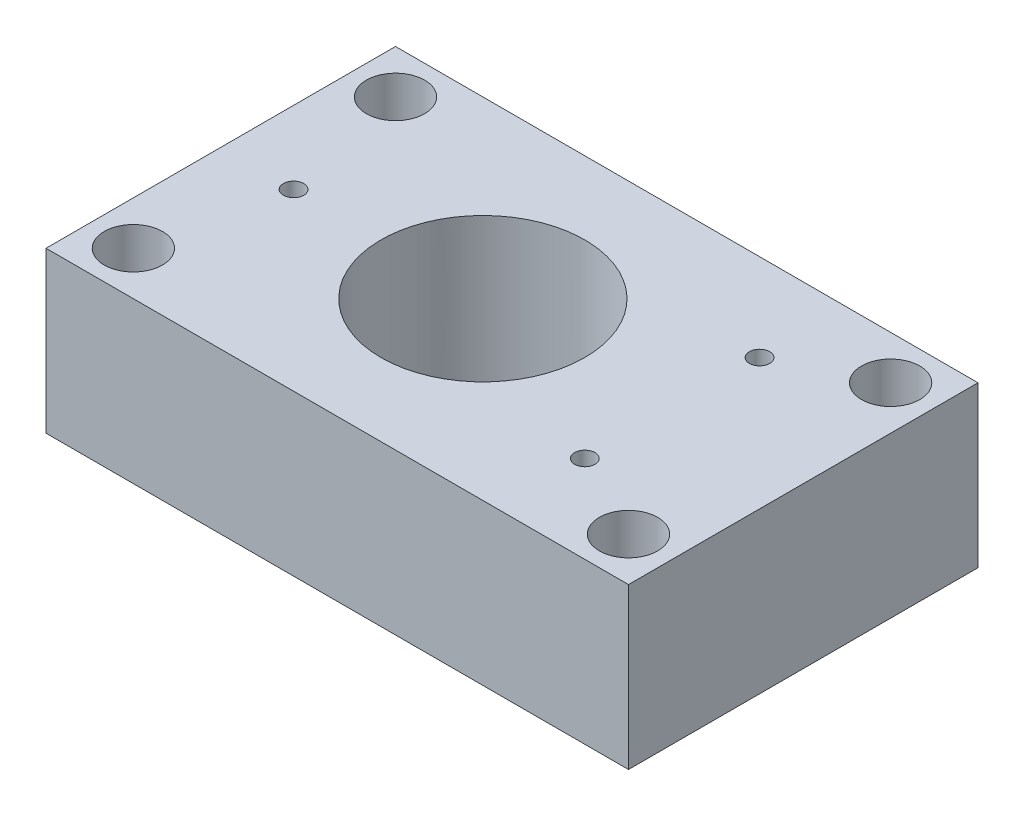
ISO-10303-21;
HEADER;
FILE_DESCRIPTION(('STEP AP214'),'2;1');
FILE_NAME('part.step','',(''),(''),'','','');
FILE_SCHEMA(('AUTOMOTIVE_DESIGN { 1 0 10303 214 1 1 1 1 }'));
ENDSEC;
DATA;
#1=APPLICATION_CONTEXT('core data for automotive mechanical design processes');
#2=APPLICATION_PROTOCOL_DEFINITION('international standard','automotive_design',2000,#1);
#3=PRODUCT_CONTEXT('',#1,'mechanical');
#4=PRODUCT('Part','Part','',(#3));
#5=PRODUCT_RELATED_PRODUCT_CATEGORY('part','',(#4));
#6=PRODUCT_DEFINITION_FORMATION('','',#4);
#7=PRODUCT_DEFINITION_CONTEXT('part definition',#1,'design');
#8=PRODUCT_DEFINITION('design','',#6,#7);
#9=PRODUCT_DEFINITION_SHAPE('','',#8);
#10=(LENGTH_UNIT() NAMED_UNIT(*) SI_UNIT(.MILLI.,.METRE.));
#11=(NAMED_UNIT(*) PLANE_ANGLE_UNIT() SI_UNIT($,.RADIAN.));
#12=(NAMED_UNIT(*) SI_UNIT($,.STERADIAN.) SOLID_ANGLE_UNIT());
#13=UNCERTAINTY_MEASURE_WITH_UNIT(LENGTH_MEASURE(1.E-05),#10,'distance_accuracy_value','');
#14=(GEOMETRIC_REPRESENTATION_CONTEXT(3) GLOBAL_UNCERTAINTY_ASSIGNED_CONTEXT((#13)) GLOBAL_UNIT_ASSIGNED_CONTEXT((#10,
#11,#12)) REPRESENTATION_CONTEXT('',''));
#15=CARTESIAN_POINT('',(0.,0.,0.));
#16=DIRECTION('',(0.,0.,1.));
#17=DIRECTION('',(1.,0.,0.));
#18=AXIS2_PLACEMENT_3D('',#15,#16,#17);
#19=CARTESIAN_POINT('',(1.5,5.5,1.5));
#20=DIRECTION('',(0.,-1.,0.));
#21=DIRECTION('',(0.,0.,-1.));
#22=AXIS2_PLACEMENT_3D('',#19,#20,#21);
#23=CYLINDRICAL_SURFACE('',#22,0.75);
#24=CARTESIAN_POINT('',(1.5,0.,1.5));
#25=DIRECTION('',(0.,1.,0.));
#26=DIRECTION('',(0.,0.,1.));
#27=AXIS2_PLACEMENT_3D('',#24,#25,#26);
#28=CIRCLE('',#27,0.75);
#29=CARTESIAN_POINT('',(1.5,0.,2.25));
#30=VERTEX_POINT('',#29);
#31=EDGE_CURVE('E164',#30,#30,#28,.F.);
#32=ORIENTED_EDGE('',*,*,#31,.T.);
#33=EDGE_LOOP('',(#32));
#34=FACE_BOUND('',#33,.T.);
#35=CARTESIAN_POINT('',(1.5,1.,1.5));
#36=DIRECTION('',(0.,1.,0.));
#37=DIRECTION('',(0.,0.,1.));
#38=AXIS2_PLACEMENT_3D('',#35,#36,#37);
#39=CIRCLE('',#38,0.75);
#40=CARTESIAN_POINT('',(1.5,1.,2.25));
#41=VERTEX_POINT('',#40);
#42=EDGE_CURVE('E56',#41,#41,#39,.T.);
#43=ORIENTED_EDGE('',*,*,#42,.T.);
#44=EDGE_LOOP('',(#43));
#45=FACE_BOUND('',#44,.T.);
#46=ADVANCED_FACE('F52',(#34,#45),#23,.F.);
#47=CARTESIAN_POINT('',(18.5,5.5,1.5));
#48=DIRECTION('',(0.,-1.,0.));
#49=DIRECTION('',(0.,0.,-1.));
#50=AXIS2_PLACEMENT_3D('',#47,#48,#49);
#51=CYLINDRICAL_SURFACE('',#50,0.750000000000002);
#52=CARTESIAN_POINT('',(18.5,0.,1.5));
#53=DIRECTION('',(0.,1.,0.));
#54=DIRECTION('',(0.,0.,1.));
#55=AXIS2_PLACEMENT_3D('',#52,#53,#54);
#56=CIRCLE('',#55,0.750000000000002);
#57=CARTESIAN_POINT('',(18.5,0.,2.25));
#58=VERTEX_POINT('',#57);
#59=EDGE_CURVE('E177',#58,#58,#56,.F.);
#60=ORIENTED_EDGE('',*,*,#59,.T.);
#61=EDGE_LOOP('',(#60));
#62=FACE_BOUND('',#61,.T.);
#63=CARTESIAN_POINT('',(18.5,1.,1.5));
#64=DIRECTION('',(0.,1.,0.));
#65=DIRECTION('',(0.,0.,1.));
#66=AXIS2_PLACEMENT_3D('',#63,#64,#65);
#67=CIRCLE('',#66,0.750000000000002);
#68=CARTESIAN_POINT('',(18.5,1.,2.25));
#69=VERTEX_POINT('',#68);
#70=EDGE_CURVE('E191',#69,#69,#67,.T.);
#71=ORIENTED_EDGE('',*,*,#70,.T.);
#72=EDGE_LOOP('',(#71));
#73=FACE_BOUND('',#72,.T.);
#74=ADVANCED_FACE('F238',(#62,#73),#51,.F.);
#75=CARTESIAN_POINT('',(18.5,5.5,10.5));
#76=DIRECTION('',(0.,-1.,0.));
#77=DIRECTION('',(0.,0.,-1.));
#78=AXIS2_PLACEMENT_3D('',#75,#76,#77);
#79=CYLINDRICAL_SURFACE('',#78,0.750000000000002);
#80=CARTESIAN_POINT('',(18.5,0.,10.5));
#81=DIRECTION('',(0.,1.,0.));
#82=DIRECTION('',(0.,0.,1.));
#83=AXIS2_PLACEMENT_3D('',#80,#81,#82);
#84=CIRCLE('',#83,0.750000000000002);
#85=CARTESIAN_POINT('',(18.5,0.,11.25));
#86=VERTEX_POINT('',#85);
#87=EDGE_CURVE('E180',#86,#86,#84,.F.);
#88=ORIENTED_EDGE('',*,*,#87,.T.);
#89=EDGE_LOOP('',(#88));
#90=FACE_BOUND('',#89,.T.);
#91=CARTESIAN_POINT('',(18.5,1.,10.5));
#92=DIRECTION('',(0.,1.,0.));
#93=DIRECTION('',(0.,0.,1.));
#94=AXIS2_PLACEMENT_3D('',#91,#92,#93);
#95=CIRCLE('',#94,0.750000000000002);
#96=CARTESIAN_POINT('',(18.5,1.,11.25));
#97=VERTEX_POINT('',#96);
#98=EDGE_CURVE('E188',#97,#97,#95,.T.);
#99=ORIENTED_EDGE('',*,*,#98,.T.);
#100=EDGE_LOOP('',(#99));
#101=FACE_BOUND('',#100,.T.);
#102=ADVANCED_FACE('F233',(#90,#101),#79,.F.);
#103=CARTESIAN_POINT('',(1.5,5.5,10.5));
#104=DIRECTION('',(0.,-1.,0.));
#105=DIRECTION('',(0.,0.,-1.));
#106=AXIS2_PLACEMENT_3D('',#103,#104,#105);
#107=CYLINDRICAL_SURFACE('',#106,0.75);
#108=CARTESIAN_POINT('',(1.5,0.,10.5));
#109=DIRECTION('',(0.,1.,0.));
#110=DIRECTION('',(0.,0.,1.));
#111=AXIS2_PLACEMENT_3D('',#108,#109,#110);
#112=CIRCLE('',#111,0.75);
#113=CARTESIAN_POINT('',(1.5,0.,11.25));
#114=VERTEX_POINT('',#113);
#115=EDGE_CURVE('E128',#114,#114,#112,.F.);
#116=ORIENTED_EDGE('',*,*,#115,.T.);
#117=EDGE_LOOP('',(#116));
#118=FACE_BOUND('',#117,.T.);
#119=CARTESIAN_POINT('',(1.5,1.,10.5));
#120=DIRECTION('',(0.,1.,0.));
#121=DIRECTION('',(0.,0.,1.));
#122=AXIS2_PLACEMENT_3D('',#119,#120,#121);
#123=CIRCLE('',#122,0.75);
#124=CARTESIAN_POINT('',(1.5,1.,11.25));
#125=VERTEX_POINT('',#124);
#126=EDGE_CURVE('E185',#125,#125,#123,.T.);
#127=ORIENTED_EDGE('',*,*,#126,.T.);
#128=EDGE_LOOP('',(#127));
#129=FACE_BOUND('',#128,.T.);
#130=ADVANCED_FACE('F228',(#118,#129),#107,.F.);
#131=CARTESIAN_POINT('',(9.,5.5,6.));
#132=DIRECTION('',(0.,-1.,0.));
#133=DIRECTION('',(0.,0.,-1.));
#134=AXIS2_PLACEMENT_3D('',#131,#132,#133);
#135=CYLINDRICAL_SURFACE('',#134,3.5);
#136=CARTESIAN_POINT('',(9.,5.5,6.));
#137=DIRECTION('',(0.,1.,0.));
#138=DIRECTION('',(0.,0.,1.));
#139=AXIS2_PLACEMENT_3D('',#136,#137,#138);
#140=CIRCLE('',#139,3.5);
#141=CARTESIAN_POINT('',(9.,5.5,9.5));
#142=VERTEX_POINT('',#141);
#143=EDGE_CURVE('E131',#142,#142,#140,.T.);
#144=ORIENTED_EDGE('',*,*,#143,.T.);
#145=EDGE_LOOP('',(#144));
#146=FACE_BOUND('',#145,.T.);
#147=CARTESIAN_POINT('',(9.,1.6,6.));
#148=DIRECTION('',(0.,1.,0.));
#149=DIRECTION('',(0.,0.,1.));
#150=AXIS2_PLACEMENT_3D('',#147,#148,#149);
#151=CIRCLE('',#150,3.5);
#152=CARTESIAN_POINT('',(12.435625,1.6,6.66819223235159));
#153=VERTEX_POINT('',#152);
#154=CARTESIAN_POINT('',(12.435625,1.6,5.3318077676484));
#155=VERTEX_POINT('',#154);
#156=EDGE_CURVE('E121',#153,#155,#151,.T.);
#157=ORIENTED_EDGE('',*,*,#156,.F.);
#158=DIRECTION('',(0.,-1.,0.));
#159=VECTOR('',#158,1.);
#160=CARTESIAN_POINT('',(12.435625,0.8,6.66819223235159));
#161=LINE('',#160,#159);
#162=CARTESIAN_POINT('',(12.435625,0.,6.66819223235159));
#163=VERTEX_POINT('',#162);
#164=EDGE_CURVE('E13',#153,#163,#161,.T.);
#165=ORIENTED_EDGE('',*,*,#164,.T.);
#166=CARTESIAN_POINT('',(9.,0.,6.));
#167=DIRECTION('',(0.,1.,0.));
#168=DIRECTION('',(0.,0.,1.));
#169=AXIS2_PLACEMENT_3D('',#166,#167,#168);
#170=CIRCLE('',#169,3.5);
#171=CARTESIAN_POINT('',(12.435625,0.,5.3318077676484));
#172=VERTEX_POINT('',#171);
#173=EDGE_CURVE('E127',#172,#163,#170,.T.);
#174=ORIENTED_EDGE('',*,*,#173,.F.);
#175=DIRECTION('',(0.,-1.,0.));
#176=VECTOR('',#175,1.);
#177=CARTESIAN_POINT('',(12.435625,0.8,5.3318077676484));
#178=LINE('',#177,#176);
#179=EDGE_CURVE('E61',#172,#155,#178,.F.);
#180=ORIENTED_EDGE('',*,*,#179,.T.);
#181=EDGE_LOOP('',(#157,#165,#174,#180));
#182=FACE_BOUND('',#181,.T.);
#183=ADVANCED_FACE('F130',(#146,#182),#135,.F.);
#184=CARTESIAN_POINT('',(0.,5.5,0.));
#185=DIRECTION('',(0.,1.,0.));
#186=DIRECTION('',(0.,0.,1.));
#187=AXIS2_PLACEMENT_3D('',#184,#185,#186);
#188=PLANE('',#187);
#189=CARTESIAN_POINT('',(18.5,5.5,10.5));
#190=DIRECTION('',(0.,1.,0.));
#191=DIRECTION('',(0.,0.,1.));
#192=AXIS2_PLACEMENT_3D('',#189,#190,#191);
#193=CIRCLE('',#192,1.);
#194=CARTESIAN_POINT('',(18.5,5.5,11.5));
#195=VERTEX_POINT('',#194);
#196=EDGE_CURVE('E316',#195,#195,#193,.T.);
#197=ORIENTED_EDGE('',*,*,#196,.F.);
#198=EDGE_LOOP('',(#197));
#199=FACE_BOUND('',#198,.T.);
#200=CARTESIAN_POINT('',(18.5,5.5,1.5));
#201=DIRECTION('',(0.,1.,0.));
#202=DIRECTION('',(0.,0.,1.));
#203=AXIS2_PLACEMENT_3D('',#200,#201,#202);
#204=CIRCLE('',#203,1.);
#205=CARTESIAN_POINT('',(18.5,5.5,2.5));
#206=VERTEX_POINT('',#205);
#207=EDGE_CURVE('E322',#206,#206,#204,.T.);
#208=ORIENTED_EDGE('',*,*,#207,.F.);
#209=EDGE_LOOP('',(#208));
#210=FACE_BOUND('',#209,.T.);
#211=CARTESIAN_POINT('',(1.5,5.5,1.5));
#212=DIRECTION('',(0.,1.,0.));
#213=DIRECTION('',(0.,0.,1.));
#214=AXIS2_PLACEMENT_3D('',#211,#212,#213);
#215=CIRCLE('',#214,1.);
#216=CARTESIAN_POINT('',(1.5,5.5,2.5));
#217=VERTEX_POINT('',#216);
#218=EDGE_CURVE('E327',#217,#217,#215,.T.);
#219=ORIENTED_EDGE('',*,*,#218,.F.);
#220=EDGE_LOOP('',(#219));
#221=FACE_BOUND('',#220,.T.);
#222=CARTESIAN_POINT('',(1.5,5.5,10.5));
#223=DIRECTION('',(0.,1.,0.));
#224=DIRECTION('',(0.,0.,1.));
#225=AXIS2_PLACEMENT_3D('',#222,#223,#224);
#226=CIRCLE('',#225,1.);
#227=CARTESIAN_POINT('',(1.5,5.5,11.5));
#228=VERTEX_POINT('',#227);
#229=EDGE_CURVE('E325',#228,#228,#226,.T.);
#230=ORIENTED_EDGE('',*,*,#229,.F.);
#231=EDGE_LOOP('',(#230));
#232=FACE_BOUND('',#231,.T.);
#233=CARTESIAN_POINT('',(15.5,5.5,3.));
#234=DIRECTION('',(0.,1.,0.));
#235=DIRECTION('',(0.,0.,1.));
#236=AXIS2_PLACEMENT_3D('',#233,#234,#235);
#237=CIRCLE('',#236,0.350000000000001);
#238=CARTESIAN_POINT('',(15.5,5.5,3.35));
#239=VERTEX_POINT('',#238);
#240=EDGE_CURVE('E168',#239,#239,#237,.T.);
#241=ORIENTED_EDGE('',*,*,#240,.F.);
#242=EDGE_LOOP('',(#241));
#243=FACE_BOUND('',#242,.T.);
#244=CARTESIAN_POINT('',(15.5,5.5,9.));
#245=DIRECTION('',(0.,1.,0.));
#246=DIRECTION('',(0.,0.,1.));
#247=AXIS2_PLACEMENT_3D('',#244,#245,#246);
#248=CIRCLE('',#247,0.350000000000001);
#249=CARTESIAN_POINT('',(15.5,5.5,9.35));
#250=VERTEX_POINT('',#249);
#251=EDGE_CURVE('E200',#250,#250,#248,.T.);
#252=ORIENTED_EDGE('',*,*,#251,.F.);
#253=EDGE_LOOP('',(#252));
#254=FACE_BOUND('',#253,.T.);
#255=CARTESIAN_POINT('',(2.5,5.5,6.));
#256=DIRECTION('',(0.,1.,0.));
#257=DIRECTION('',(0.,0.,1.));
#258=AXIS2_PLACEMENT_3D('',#255,#256,#257);
#259=CIRCLE('',#258,0.350000000000001);
#260=CARTESIAN_POINT('',(2.5,5.5,6.35));
#261=VERTEX_POINT('',#260);
#262=EDGE_CURVE('E196',#261,#261,#259,.T.);
#263=ORIENTED_EDGE('',*,*,#262,.F.);
#264=EDGE_LOOP('',(#263));
#265=FACE_BOUND('',#264,.T.);
#266=DIRECTION('',(0.,0.,1.));
#267=VECTOR('',#266,1.);
#268=CARTESIAN_POINT('',(0.,5.5,0.));
#269=LINE('',#268,#267);
#270=CARTESIAN_POINT('',(0.,5.5,0.));
#271=VERTEX_POINT('',#270);
#272=CARTESIAN_POINT('',(0.,5.5,12.));
#273=VERTEX_POINT('',#272);
#274=EDGE_CURVE('E138',#271,#273,#269,.T.);
#275=ORIENTED_EDGE('',*,*,#274,.T.);
#276=DIRECTION('',(1.,0.,0.));
#277=VECTOR('',#276,1.);
#278=CARTESIAN_POINT('',(0.,5.5,12.));
#279=LINE('',#278,#277);
#280=CARTESIAN_POINT('',(20.,5.5,12.));
#281=VERTEX_POINT('',#280);
#282=EDGE_CURVE('E104',#273,#281,#279,.T.);
#283=ORIENTED_EDGE('',*,*,#282,.T.);
#284=DIRECTION('',(0.,0.,1.));
#285=VECTOR('',#284,1.);
#286=CARTESIAN_POINT('',(20.,5.5,0.));
#287=LINE('',#286,#285);
#288=CARTESIAN_POINT('',(20.,5.5,0.));
#289=VERTEX_POINT('',#288);
#290=EDGE_CURVE('E142',#289,#281,#287,.T.);
#291=ORIENTED_EDGE('',*,*,#290,.F.);
#292=DIRECTION('',(1.,0.,0.));
#293=VECTOR('',#292,1.);
#294=CARTESIAN_POINT('',(0.,5.5,0.));
#295=LINE('',#294,#293);
#296=EDGE_CURVE('E145',#271,#289,#295,.T.);
#297=ORIENTED_EDGE('',*,*,#296,.F.);
#298=EDGE_LOOP('',(#275,#283,#291,#297));
#299=FACE_BOUND('',#298,.T.);
#300=ORIENTED_EDGE('',*,*,#143,.F.);
#301=EDGE_LOOP('',(#300));
#302=FACE_BOUND('',#301,.T.);
#303=ADVANCED_FACE('F214',(#199,#210,#221,#232,#243,#254,#265,#299,#302),#188,.T.);
#304=CARTESIAN_POINT('',(0.,0.,0.));
#305=DIRECTION('',(0.,1.,0.));
#306=DIRECTION('',(0.,0.,1.));
#307=AXIS2_PLACEMENT_3D('',#304,#305,#306);
#308=PLANE('',#307);
#309=ORIENTED_EDGE('',*,*,#115,.F.);
#310=EDGE_LOOP('',(#309));
#311=FACE_BOUND('',#310,.T.);
#312=ORIENTED_EDGE('',*,*,#87,.F.);
#313=EDGE_LOOP('',(#312));
#314=FACE_BOUND('',#313,.T.);
#315=ORIENTED_EDGE('',*,*,#59,.F.);
#316=EDGE_LOOP('',(#315));
#317=FACE_BOUND('',#316,.T.);
#318=CARTESIAN_POINT('',(15.5,0.,3.));
#319=DIRECTION('',(0.,1.,0.));
#320=DIRECTION('',(0.,0.,1.));
#321=AXIS2_PLACEMENT_3D('',#318,#319,#320);
#322=CIRCLE('',#321,0.350000000000001);
#323=CARTESIAN_POINT('',(15.5,0.,3.35));
#324=VERTEX_POINT('',#323);
#325=EDGE_CURVE('E174',#324,#324,#322,.F.);
#326=ORIENTED_EDGE('',*,*,#325,.F.);
#327=EDGE_LOOP('',(#326));
#328=FACE_BOUND('',#327,.T.);
#329=CARTESIAN_POINT('',(15.5,0.,9.));
#330=DIRECTION('',(0.,1.,0.));
#331=DIRECTION('',(0.,0.,1.));
#332=AXIS2_PLACEMENT_3D('',#329,#330,#331);
#333=CIRCLE('',#332,0.350000000000001);
#334=CARTESIAN_POINT('',(15.5,0.,9.35));
#335=VERTEX_POINT('',#334);
#336=EDGE_CURVE('E171',#335,#335,#333,.F.);
#337=ORIENTED_EDGE('',*,*,#336,.F.);
#338=EDGE_LOOP('',(#337));
#339=FACE_BOUND('',#338,.T.);
#340=CARTESIAN_POINT('',(2.5,0.,6.));
#341=DIRECTION('',(0.,1.,0.));
#342=DIRECTION('',(0.,0.,1.));
#343=AXIS2_PLACEMENT_3D('',#340,#341,#342);
#344=CIRCLE('',#343,0.350000000000001);
#345=CARTESIAN_POINT('',(2.5,0.,6.35));
#346=VERTEX_POINT('',#345);
#347=EDGE_CURVE('E167',#346,#346,#344,.F.);
#348=ORIENTED_EDGE('',*,*,#347,.F.);
#349=EDGE_LOOP('',(#348));
#350=FACE_BOUND('',#349,.T.);
#351=ORIENTED_EDGE('',*,*,#31,.F.);
#352=EDGE_LOOP('',(#351));
#353=FACE_BOUND('',#352,.T.);
#354=CARTESIAN_POINT('',(15.,0.,5.99999999999999));
#355=DIRECTION('',(0.,1.,0.));
#356=DIRECTION('',(0.,0.,1.));
#357=AXIS2_PLACEMENT_3D('',#354,#355,#356);
#358=CIRCLE('',#357,2.65);
#359=EDGE_CURVE('E117',#163,#172,#358,.T.);
#360=ORIENTED_EDGE('',*,*,#359,.T.);
#361=ORIENTED_EDGE('',*,*,#173,.T.);
#362=EDGE_LOOP('',(#360,#361));
#363=FACE_BOUND('',#362,.T.);
#364=DIRECTION('',(0.,0.,1.));
#365=VECTOR('',#364,1.);
#366=CARTESIAN_POINT('',(0.,0.,0.));
#367=LINE('',#366,#365);
#368=CARTESIAN_POINT('',(0.,0.,0.));
#369=VERTEX_POINT('',#368);
#370=CARTESIAN_POINT('',(0.,0.,12.));
#371=VERTEX_POINT('',#370);
#372=EDGE_CURVE('E134',#369,#371,#367,.T.);
#373=ORIENTED_EDGE('',*,*,#372,.F.);
#374=DIRECTION('',(1.,0.,0.));
#375=VECTOR('',#374,1.);
#376=CARTESIAN_POINT('',(0.,0.,0.));
#377=LINE('',#376,#375);
#378=CARTESIAN_POINT('',(20.,0.,0.));
#379=VERTEX_POINT('',#378);
#380=EDGE_CURVE('E140',#369,#379,#377,.T.);
#381=ORIENTED_EDGE('',*,*,#380,.T.);
#382=DIRECTION('',(0.,0.,1.));
#383=VECTOR('',#382,1.);
#384=CARTESIAN_POINT('',(20.,0.,0.));
#385=LINE('',#384,#383);
#386=CARTESIAN_POINT('',(20.,0.,12.));
#387=VERTEX_POINT('',#386);
#388=EDGE_CURVE('E151',#379,#387,#385,.T.);
#389=ORIENTED_EDGE('',*,*,#388,.T.);
#390=DIRECTION('',(1.,0.,0.));
#391=VECTOR('',#390,1.);
#392=CARTESIAN_POINT('',(0.,0.,12.));
#393=LINE('',#392,#391);
#394=EDGE_CURVE('E148',#371,#387,#393,.T.);
#395=ORIENTED_EDGE('',*,*,#394,.F.);
#396=EDGE_LOOP('',(#373,#381,#389,#395));
#397=FACE_BOUND('',#396,.T.);
#398=ADVANCED_FACE('F125',(#311,#314,#317,#328,#339,#350,#353,#363,#397),#308,.F.);
#399=CARTESIAN_POINT('',(0.,5.5,0.));
#400=DIRECTION('',(1.,0.,0.));
#401=DIRECTION('',(0.,0.,-1.));
#402=AXIS2_PLACEMENT_3D('',#399,#400,#401);
#403=PLANE('',#402);
#404=ORIENTED_EDGE('',*,*,#372,.T.);
#405=DIRECTION('',(0.,-1.,0.));
#406=VECTOR('',#405,1.);
#407=CARTESIAN_POINT('',(0.,5.5,12.));
#408=LINE('',#407,#406);
#409=EDGE_CURVE('E161',#273,#371,#408,.T.);
#410=ORIENTED_EDGE('',*,*,#409,.F.);
#411=ORIENTED_EDGE('',*,*,#274,.F.);
#412=DIRECTION('',(0.,-1.,0.));
#413=VECTOR('',#412,1.);
#414=CARTESIAN_POINT('',(0.,5.5,0.));
#415=LINE('',#414,#413);
#416=EDGE_CURVE('E77',#271,#369,#415,.T.);
#417=ORIENTED_EDGE('',*,*,#416,.T.);
#418=EDGE_LOOP('',(#404,#410,#411,#417));
#419=FACE_BOUND('',#418,.T.);
#420=ADVANCED_FACE('F54',(#419),#403,.F.);
#421=CARTESIAN_POINT('',(0.,5.5,12.));
#422=DIRECTION('',(0.,0.,-1.));
#423=DIRECTION('',(-1.,0.,0.));
#424=AXIS2_PLACEMENT_3D('',#421,#422,#423);
#425=PLANE('',#424);
#426=ORIENTED_EDGE('',*,*,#394,.T.);
#427=DIRECTION('',(0.,-1.,0.));
#428=VECTOR('',#427,1.);
#429=CARTESIAN_POINT('',(20.,5.5,12.));
#430=LINE('',#429,#428);
#431=EDGE_CURVE('E159',#281,#387,#430,.T.);
#432=ORIENTED_EDGE('',*,*,#431,.F.);
#433=ORIENTED_EDGE('',*,*,#282,.F.);
#434=ORIENTED_EDGE('',*,*,#409,.T.);
#435=EDGE_LOOP('',(#426,#432,#433,#434));
#436=FACE_BOUND('',#435,.T.);
#437=ADVANCED_FACE('F261',(#436),#425,.F.);
#438=CARTESIAN_POINT('',(20.,5.5,0.));
#439=DIRECTION('',(1.,0.,0.));
#440=DIRECTION('',(0.,0.,-1.));
#441=AXIS2_PLACEMENT_3D('',#438,#439,#440);
#442=PLANE('',#441);
#443=ORIENTED_EDGE('',*,*,#388,.F.);
#444=DIRECTION('',(0.,-1.,0.));
#445=VECTOR('',#444,1.);
#446=CARTESIAN_POINT('',(20.,5.5,0.));
#447=LINE('',#446,#445);
#448=EDGE_CURVE('E157',#289,#379,#447,.T.);
#449=ORIENTED_EDGE('',*,*,#448,.F.);
#450=ORIENTED_EDGE('',*,*,#290,.T.);
#451=ORIENTED_EDGE('',*,*,#431,.T.);
#452=EDGE_LOOP('',(#443,#449,#450,#451));
#453=FACE_BOUND('',#452,.T.);
#454=ADVANCED_FACE('F256',(#453),#442,.T.);
#455=CARTESIAN_POINT('',(0.,5.5,0.));
#456=DIRECTION('',(0.,0.,-1.));
#457=DIRECTION('',(-1.,0.,0.));
#458=AXIS2_PLACEMENT_3D('',#455,#456,#457);
#459=PLANE('',#458);
#460=ORIENTED_EDGE('',*,*,#380,.F.);
#461=ORIENTED_EDGE('',*,*,#416,.F.);
#462=ORIENTED_EDGE('',*,*,#296,.T.);
#463=ORIENTED_EDGE('',*,*,#448,.T.);
#464=EDGE_LOOP('',(#460,#461,#462,#463));
#465=FACE_BOUND('',#464,.T.);
#466=ADVANCED_FACE('F252',(#465),#459,.T.);
#467=CARTESIAN_POINT('',(15.,1.6,5.99999999999999));
#468=DIRECTION('',(0.,-1.,0.));
#469=DIRECTION('',(0.,0.,-1.));
#470=AXIS2_PLACEMENT_3D('',#467,#468,#469);
#471=CYLINDRICAL_SURFACE('',#470,2.65);
#472=CARTESIAN_POINT('',(15.,1.6,5.99999999999999));
#473=DIRECTION('',(0.,1.,0.));
#474=DIRECTION('',(0.,0.,1.));
#475=AXIS2_PLACEMENT_3D('',#472,#473,#474);
#476=CIRCLE('',#475,2.65);
#477=EDGE_CURVE('E68',#153,#155,#476,.T.);
#478=ORIENTED_EDGE('',*,*,#477,.T.);
#479=ORIENTED_EDGE('',*,*,#179,.F.);
#480=ORIENTED_EDGE('',*,*,#359,.F.);
#481=ORIENTED_EDGE('',*,*,#164,.F.);
#482=EDGE_LOOP('',(#478,#479,#480,#481));
#483=FACE_BOUND('',#482,.T.);
#484=ADVANCED_FACE('F116',(#483),#471,.F.);
#485=CARTESIAN_POINT('',(15.,1.6,5.99999999999999));
#486=DIRECTION('',(0.,1.,0.));
#487=DIRECTION('',(0.,0.,1.));
#488=AXIS2_PLACEMENT_3D('',#485,#486,#487);
#489=PLANE('',#488);
#490=ORIENTED_EDGE('',*,*,#156,.T.);
#491=ORIENTED_EDGE('',*,*,#477,.F.);
#492=EDGE_LOOP('',(#490,#491));
#493=FACE_BOUND('',#492,.T.);
#494=ADVANCED_FACE('F248',(#493),#489,.F.);
#495=CARTESIAN_POINT('',(2.5,5.5,6.));
#496=DIRECTION('',(0.,-1.,0.));
#497=DIRECTION('',(0.,0.,-1.));
#498=AXIS2_PLACEMENT_3D('',#495,#496,#497);
#499=CYLINDRICAL_SURFACE('',#498,0.350000000000001);
#500=ORIENTED_EDGE('',*,*,#262,.T.);
#501=EDGE_LOOP('',(#500));
#502=FACE_BOUND('',#501,.T.);
#503=ORIENTED_EDGE('',*,*,#347,.T.);
#504=EDGE_LOOP('',(#503));
#505=FACE_BOUND('',#504,.T.);
#506=ADVANCED_FACE('F250',(#502,#505),#499,.F.);
#507=CARTESIAN_POINT('',(15.5,5.5,9.));
#508=DIRECTION('',(0.,-1.,0.));
#509=DIRECTION('',(0.,0.,-1.));
#510=AXIS2_PLACEMENT_3D('',#507,#508,#509);
#511=CYLINDRICAL_SURFACE('',#510,0.350000000000001);
#512=ORIENTED_EDGE('',*,*,#251,.T.);
#513=EDGE_LOOP('',(#512));
#514=FACE_BOUND('',#513,.T.);
#515=ORIENTED_EDGE('',*,*,#336,.T.);
#516=EDGE_LOOP('',(#515));
#517=FACE_BOUND('',#516,.T.);
#518=ADVANCED_FACE('F290',(#514,#517),#511,.F.);
#519=CARTESIAN_POINT('',(15.5,5.5,3.));
#520=DIRECTION('',(0.,-1.,0.));
#521=DIRECTION('',(0.,0.,-1.));
#522=AXIS2_PLACEMENT_3D('',#519,#520,#521);
#523=CYLINDRICAL_SURFACE('',#522,0.350000000000001);
#524=ORIENTED_EDGE('',*,*,#240,.T.);
#525=EDGE_LOOP('',(#524));
#526=FACE_BOUND('',#525,.T.);
#527=ORIENTED_EDGE('',*,*,#325,.T.);
#528=EDGE_LOOP('',(#527));
#529=FACE_BOUND('',#528,.T.);
#530=ADVANCED_FACE('F211',(#526,#529),#523,.F.);
#531=CARTESIAN_POINT('',(1.5,-2.82842712474619,10.5));
#532=DIRECTION('',(0.,1.,0.));
#533=DIRECTION('',(0.,0.,1.));
#534=AXIS2_PLACEMENT_3D('',#531,#532,#533);
#535=CYLINDRICAL_SURFACE('',#534,1.);
#536=CARTESIAN_POINT('',(1.5,1.,10.5));
#537=DIRECTION('',(0.,1.,0.));
#538=DIRECTION('',(0.,0.,1.));
#539=AXIS2_PLACEMENT_3D('',#536,#537,#538);
#540=CIRCLE('',#539,1.);
#541=CARTESIAN_POINT('',(1.5,1.,11.5));
#542=VERTEX_POINT('',#541);
#543=EDGE_CURVE('E189',#542,#542,#540,.F.);
#544=ORIENTED_EDGE('',*,*,#543,.T.);
#545=EDGE_LOOP('',(#544));
#546=FACE_BOUND('',#545,.T.);
#547=ORIENTED_EDGE('',*,*,#229,.T.);
#548=EDGE_LOOP('',(#547));
#549=FACE_BOUND('',#548,.T.);
#550=ADVANCED_FACE('F331',(#546,#549),#535,.F.);
#551=CARTESIAN_POINT('',(0.,1.,0.));
#552=DIRECTION('',(0.,1.,0.));
#553=DIRECTION('',(0.,0.,1.));
#554=AXIS2_PLACEMENT_3D('',#551,#552,#553);
#555=PLANE('',#554);
#556=ORIENTED_EDGE('',*,*,#126,.F.);
#557=EDGE_LOOP('',(#556));
#558=FACE_BOUND('',#557,.T.);
#559=ORIENTED_EDGE('',*,*,#543,.F.);
#560=EDGE_LOOP('',(#559));
#561=FACE_BOUND('',#560,.T.);
#562=ADVANCED_FACE('F334',(#558,#561),#555,.T.);
#563=CARTESIAN_POINT('',(18.5,-2.82842712474619,10.5));
#564=DIRECTION('',(0.,1.,0.));
#565=DIRECTION('',(0.,0.,1.));
#566=AXIS2_PLACEMENT_3D('',#563,#564,#565);
#567=CYLINDRICAL_SURFACE('',#566,1.);
#568=CARTESIAN_POINT('',(18.5,1.,10.5));
#569=DIRECTION('',(0.,1.,0.));
#570=DIRECTION('',(0.,0.,1.));
#571=AXIS2_PLACEMENT_3D('',#568,#569,#570);
#572=CIRCLE('',#571,1.);
#573=CARTESIAN_POINT('',(18.5,1.,11.5));
#574=VERTEX_POINT('',#573);
#575=EDGE_CURVE('E314',#574,#574,#572,.F.);
#576=ORIENTED_EDGE('',*,*,#575,.T.);
#577=EDGE_LOOP('',(#576));
#578=FACE_BOUND('',#577,.T.);
#579=ORIENTED_EDGE('',*,*,#196,.T.);
#580=EDGE_LOOP('',(#579));
#581=FACE_BOUND('',#580,.T.);
#582=ADVANCED_FACE('F310',(#578,#581),#567,.F.);
#583=CARTESIAN_POINT('',(0.,1.,0.));
#584=DIRECTION('',(0.,1.,0.));
#585=DIRECTION('',(0.,0.,1.));
#586=AXIS2_PLACEMENT_3D('',#583,#584,#585);
#587=PLANE('',#586);
#588=ORIENTED_EDGE('',*,*,#98,.F.);
#589=EDGE_LOOP('',(#588));
#590=FACE_BOUND('',#589,.T.);
#591=ORIENTED_EDGE('',*,*,#575,.F.);
#592=EDGE_LOOP('',(#591));
#593=FACE_BOUND('',#592,.T.);
#594=ADVANCED_FACE('F306',(#590,#593),#587,.T.);
#595=CARTESIAN_POINT('',(18.5,-2.82842712474619,1.5));
#596=DIRECTION('',(0.,1.,0.));
#597=DIRECTION('',(0.,0.,1.));
#598=AXIS2_PLACEMENT_3D('',#595,#596,#597);
#599=CYLINDRICAL_SURFACE('',#598,1.);
#600=CARTESIAN_POINT('',(18.5,1.,1.5));
#601=DIRECTION('',(0.,1.,0.));
#602=DIRECTION('',(0.,0.,1.));
#603=AXIS2_PLACEMENT_3D('',#600,#601,#602);
#604=CIRCLE('',#603,1.);
#605=CARTESIAN_POINT('',(18.5,1.,2.5));
#606=VERTEX_POINT('',#605);
#607=EDGE_CURVE('E319',#606,#606,#604,.F.);
#608=ORIENTED_EDGE('',*,*,#607,.T.);
#609=EDGE_LOOP('',(#608));
#610=FACE_BOUND('',#609,.T.);
#611=ORIENTED_EDGE('',*,*,#207,.T.);
#612=EDGE_LOOP('',(#611));
#613=FACE_BOUND('',#612,.T.);
#614=ADVANCED_FACE('F309',(#610,#613),#599,.F.);
#615=CARTESIAN_POINT('',(0.,1.,0.));
#616=DIRECTION('',(0.,1.,0.));
#617=DIRECTION('',(0.,0.,1.));
#618=AXIS2_PLACEMENT_3D('',#615,#616,#617);
#619=PLANE('',#618);
#620=ORIENTED_EDGE('',*,*,#70,.F.);
#621=EDGE_LOOP('',(#620));
#622=FACE_BOUND('',#621,.T.);
#623=ORIENTED_EDGE('',*,*,#607,.F.);
#624=EDGE_LOOP('',(#623));
#625=FACE_BOUND('',#624,.T.);
#626=ADVANCED_FACE('F345',(#622,#625),#619,.T.);
#627=CARTESIAN_POINT('',(1.5,-2.82842712474619,1.5));
#628=DIRECTION('',(0.,1.,0.));
#629=DIRECTION('',(0.,0.,1.));
#630=AXIS2_PLACEMENT_3D('',#627,#628,#629);
#631=CYLINDRICAL_SURFACE('',#630,1.);
#632=CARTESIAN_POINT('',(1.5,1.,1.5));
#633=DIRECTION('',(0.,1.,0.));
#634=DIRECTION('',(0.,0.,1.));
#635=AXIS2_PLACEMENT_3D('',#632,#633,#634);
#636=CIRCLE('',#635,1.);
#637=CARTESIAN_POINT('',(1.5,1.,2.5));
#638=VERTEX_POINT('',#637);
#639=EDGE_CURVE('E364',#638,#638,#636,.F.);
#640=ORIENTED_EDGE('',*,*,#639,.T.);
#641=EDGE_LOOP('',(#640));
#642=FACE_BOUND('',#641,.T.);
#643=ORIENTED_EDGE('',*,*,#218,.T.);
#644=EDGE_LOOP('',(#643));
#645=FACE_BOUND('',#644,.T.);
#646=ADVANCED_FACE('F348',(#642,#645),#631,.F.);
#647=CARTESIAN_POINT('',(0.,1.,0.));
#648=DIRECTION('',(0.,1.,0.));
#649=DIRECTION('',(0.,0.,1.));
#650=AXIS2_PLACEMENT_3D('',#647,#648,#649);
#651=PLANE('',#650);
#652=ORIENTED_EDGE('',*,*,#42,.F.);
#653=EDGE_LOOP('',(#652));
#654=FACE_BOUND('',#653,.T.);
#655=ORIENTED_EDGE('',*,*,#639,.F.);
#656=EDGE_LOOP('',(#655));
#657=FACE_BOUND('',#656,.T.);
#658=ADVANCED_FACE('F353',(#654,#657),#651,.T.);
#659=CLOSED_SHELL('',(#46,#74,#102,#130,#183,#303,#398,#420,#437,#454,#466,#484,#494,#506,#518,
#530,#550,#562,#582,#594,#614,#626,#646,#658));
#660=MANIFOLD_SOLID_BREP('B2',#659);
#661=ADVANCED_BREP_SHAPE_REPRESENTATION('',(#18,#660),#14);
#662=SHAPE_DEFINITION_REPRESENTATION(#9,#661);
ENDSEC;
END-ISO-10303-21;
